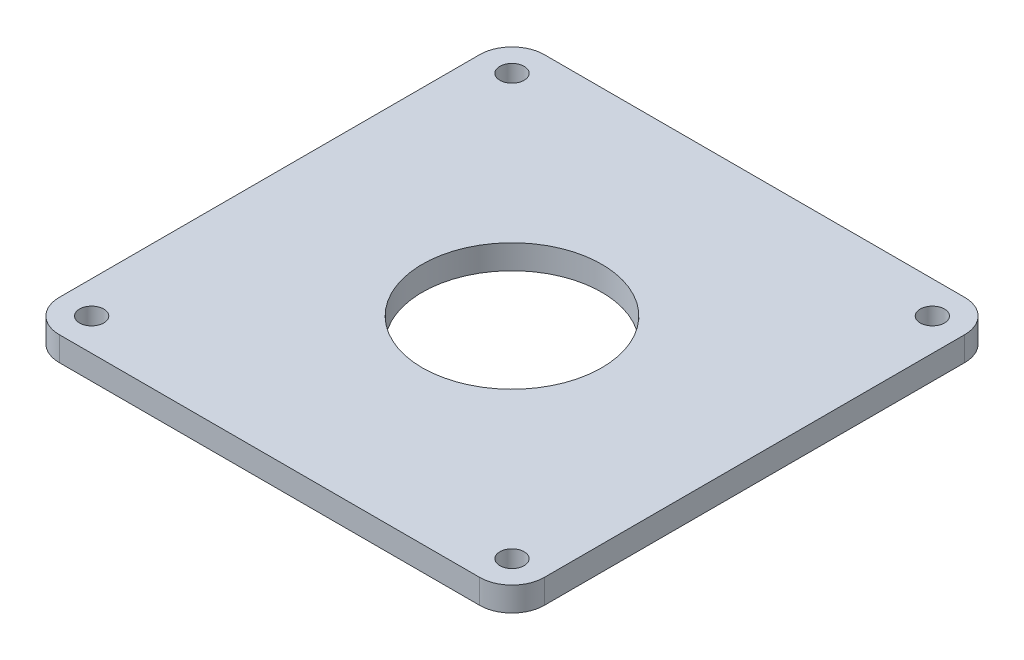
ISO-10303-21;
HEADER;
FILE_DESCRIPTION(('STEP AP214'),'2;1');
FILE_NAME('part.step','',(''),(''),'','','');
FILE_SCHEMA(('AUTOMOTIVE_DESIGN { 1 0 10303 214 1 1 1 1 }'));
ENDSEC;
DATA;
#1=APPLICATION_CONTEXT('core data for automotive mechanical design processes');
#2=APPLICATION_PROTOCOL_DEFINITION('international standard','automotive_design',2000,#1);
#3=PRODUCT_CONTEXT('',#1,'mechanical');
#4=PRODUCT('Part','Part','',(#3));
#5=PRODUCT_RELATED_PRODUCT_CATEGORY('part','',(#4));
#6=PRODUCT_DEFINITION_FORMATION('','',#4);
#7=PRODUCT_DEFINITION_CONTEXT('part definition',#1,'design');
#8=PRODUCT_DEFINITION('design','',#6,#7);
#9=PRODUCT_DEFINITION_SHAPE('','',#8);
#10=(LENGTH_UNIT() NAMED_UNIT(*) SI_UNIT(.MILLI.,.METRE.));
#11=(NAMED_UNIT(*) PLANE_ANGLE_UNIT() SI_UNIT($,.RADIAN.));
#12=(NAMED_UNIT(*) SI_UNIT($,.STERADIAN.) SOLID_ANGLE_UNIT());
#13=UNCERTAINTY_MEASURE_WITH_UNIT(LENGTH_MEASURE(1.E-05),#10,'distance_accuracy_value','');
#14=(GEOMETRIC_REPRESENTATION_CONTEXT(3) GLOBAL_UNCERTAINTY_ASSIGNED_CONTEXT((#13)) GLOBAL_UNIT_ASSIGNED_CONTEXT((#10,
#11,#12)) REPRESENTATION_CONTEXT('',''));
#15=CARTESIAN_POINT('',(0.,0.,0.));
#16=DIRECTION('',(0.,0.,1.));
#17=DIRECTION('',(1.,0.,0.));
#18=AXIS2_PLACEMENT_3D('',#15,#16,#17);
#19=CARTESIAN_POINT('',(-26.,3.,26.));
#20=DIRECTION('',(0.,-1.,0.));
#21=DIRECTION('',(0.,0.,-1.));
#22=AXIS2_PLACEMENT_3D('',#19,#20,#21);
#23=PLANE('',#22);
#24=CARTESIAN_POINT('',(-26.,3.,26.));
#25=DIRECTION('',(0.,1.,0.));
#26=DIRECTION('',(0.,0.,-1.));
#27=AXIS2_PLACEMENT_3D('',#24,#25,#26);
#28=CIRCLE('',#27,4.);
#29=CARTESIAN_POINT('',(-30.,3.,26.));
#30=VERTEX_POINT('',#29);
#31=CARTESIAN_POINT('',(-26.,3.,30.));
#32=VERTEX_POINT('',#31);
#33=EDGE_CURVE('E170',#30,#32,#28,.T.);
#34=ORIENTED_EDGE('',*,*,#33,.T.);
#35=DIRECTION('',(1.,0.,0.));
#36=VECTOR('',#35,1.);
#37=CARTESIAN_POINT('',(-26.,3.,30.));
#38=LINE('',#37,#36);
#39=CARTESIAN_POINT('',(26.,3.,30.));
#40=VERTEX_POINT('',#39);
#41=EDGE_CURVE('E106',#32,#40,#38,.T.);
#42=ORIENTED_EDGE('',*,*,#41,.T.);
#43=CARTESIAN_POINT('',(26.,3.,26.));
#44=DIRECTION('',(0.,1.,0.));
#45=DIRECTION('',(0.,0.,1.));
#46=AXIS2_PLACEMENT_3D('',#43,#44,#45);
#47=CIRCLE('',#46,4.);
#48=CARTESIAN_POINT('',(30.,3.,26.));
#49=VERTEX_POINT('',#48);
#50=EDGE_CURVE('E191',#40,#49,#47,.T.);
#51=ORIENTED_EDGE('',*,*,#50,.T.);
#52=DIRECTION('',(0.,0.,-1.));
#53=VECTOR('',#52,1.);
#54=CARTESIAN_POINT('',(30.,3.,26.));
#55=LINE('',#54,#53);
#56=CARTESIAN_POINT('',(30.,3.,-26.));
#57=VERTEX_POINT('',#56);
#58=EDGE_CURVE('E205',#49,#57,#55,.T.);
#59=ORIENTED_EDGE('',*,*,#58,.T.);
#60=CARTESIAN_POINT('',(26.,3.,-26.));
#61=DIRECTION('',(0.,1.,0.));
#62=DIRECTION('',(0.,0.,-1.));
#63=AXIS2_PLACEMENT_3D('',#60,#61,#62);
#64=CIRCLE('',#63,4.);
#65=CARTESIAN_POINT('',(26.,3.,-30.));
#66=VERTEX_POINT('',#65);
#67=EDGE_CURVE('E125',#57,#66,#64,.T.);
#68=ORIENTED_EDGE('',*,*,#67,.T.);
#69=DIRECTION('',(-1.,0.,0.));
#70=VECTOR('',#69,1.);
#71=CARTESIAN_POINT('',(-26.,3.,-30.));
#72=LINE('',#71,#70);
#73=CARTESIAN_POINT('',(-26.,3.,-30.));
#74=VERTEX_POINT('',#73);
#75=EDGE_CURVE('E119',#66,#74,#72,.T.);
#76=ORIENTED_EDGE('',*,*,#75,.T.);
#77=CARTESIAN_POINT('',(-26.,3.,-26.));
#78=DIRECTION('',(0.,1.,0.));
#79=DIRECTION('',(0.,0.,-1.));
#80=AXIS2_PLACEMENT_3D('',#77,#78,#79);
#81=CIRCLE('',#80,4.);
#82=CARTESIAN_POINT('',(-30.,3.,-26.));
#83=VERTEX_POINT('',#82);
#84=EDGE_CURVE('E123',#74,#83,#81,.T.);
#85=ORIENTED_EDGE('',*,*,#84,.T.);
#86=DIRECTION('',(0.,0.,1.));
#87=VECTOR('',#86,1.);
#88=CARTESIAN_POINT('',(-30.,3.,26.));
#89=LINE('',#88,#87);
#90=EDGE_CURVE('E63',#83,#30,#89,.T.);
#91=ORIENTED_EDGE('',*,*,#90,.T.);
#92=EDGE_LOOP('',(#34,#42,#51,#59,#68,#76,#85,#91));
#93=FACE_BOUND('',#92,.T.);
#94=CARTESIAN_POINT('',(-26.,3.,-26.));
#95=DIRECTION('',(0.,1.,0.));
#96=DIRECTION('',(0.,0.,1.));
#97=AXIS2_PLACEMENT_3D('',#94,#95,#96);
#98=CIRCLE('',#97,1.5);
#99=CARTESIAN_POINT('',(-26.,3.,-24.5));
#100=VERTEX_POINT('',#99);
#101=EDGE_CURVE('E152',#100,#100,#98,.T.);
#102=ORIENTED_EDGE('',*,*,#101,.F.);
#103=EDGE_LOOP('',(#102));
#104=FACE_BOUND('',#103,.T.);
#105=CARTESIAN_POINT('',(26.0000000000001,3.,-25.9999999999999));
#106=DIRECTION('',(0.,1.,0.));
#107=DIRECTION('',(0.,0.,1.));
#108=AXIS2_PLACEMENT_3D('',#105,#106,#107);
#109=CIRCLE('',#108,1.5);
#110=CARTESIAN_POINT('',(26.0000000000001,3.,-24.4999999999999));
#111=VERTEX_POINT('',#110);
#112=EDGE_CURVE('E219',#111,#111,#109,.T.);
#113=ORIENTED_EDGE('',*,*,#112,.F.);
#114=EDGE_LOOP('',(#113));
#115=FACE_BOUND('',#114,.T.);
#116=CARTESIAN_POINT('',(25.9999999999998,3.,26.0000000000002));
#117=DIRECTION('',(0.,1.,0.));
#118=DIRECTION('',(0.,0.,1.));
#119=AXIS2_PLACEMENT_3D('',#116,#117,#118);
#120=CIRCLE('',#119,1.5);
#121=CARTESIAN_POINT('',(25.9999999999998,3.,27.5000000000002));
#122=VERTEX_POINT('',#121);
#123=EDGE_CURVE('E227',#122,#122,#120,.T.);
#124=ORIENTED_EDGE('',*,*,#123,.F.);
#125=EDGE_LOOP('',(#124));
#126=FACE_BOUND('',#125,.T.);
#127=CARTESIAN_POINT('',(-26.0000000000003,3.,25.9999999999997));
#128=DIRECTION('',(0.,1.,0.));
#129=DIRECTION('',(0.,0.,1.));
#130=AXIS2_PLACEMENT_3D('',#127,#128,#129);
#131=CIRCLE('',#130,1.5);
#132=CARTESIAN_POINT('',(-26.0000000000003,3.,27.4999999999997));
#133=VERTEX_POINT('',#132);
#134=EDGE_CURVE('E235',#133,#133,#131,.T.);
#135=ORIENTED_EDGE('',*,*,#134,.F.);
#136=EDGE_LOOP('',(#135));
#137=FACE_BOUND('',#136,.T.);
#138=CARTESIAN_POINT('',(0.,3.,0.));
#139=DIRECTION('',(0.,1.,0.));
#140=DIRECTION('',(0.,0.,1.));
#141=AXIS2_PLACEMENT_3D('',#138,#139,#140);
#142=CIRCLE('',#141,11.1);
#143=CARTESIAN_POINT('',(0.,3.,11.1));
#144=VERTEX_POINT('',#143);
#145=EDGE_CURVE('E243',#144,#144,#142,.T.);
#146=ORIENTED_EDGE('',*,*,#145,.F.);
#147=EDGE_LOOP('',(#146));
#148=FACE_BOUND('',#147,.T.);
#149=ADVANCED_FACE('F45',(#93,#104,#115,#126,#137,#148),#23,.F.);
#150=CARTESIAN_POINT('',(-26.,0.,26.));
#151=DIRECTION('',(0.,-1.,0.));
#152=DIRECTION('',(0.,0.,-1.));
#153=AXIS2_PLACEMENT_3D('',#150,#151,#152);
#154=PLANE('',#153);
#155=CARTESIAN_POINT('',(-26.0000000000003,0.,25.9999999999997));
#156=DIRECTION('',(0.,1.,0.));
#157=DIRECTION('',(0.,0.,1.));
#158=AXIS2_PLACEMENT_3D('',#155,#156,#157);
#159=CIRCLE('',#158,1.5);
#160=CARTESIAN_POINT('',(-26.0000000000003,0.,27.4999999999997));
#161=VERTEX_POINT('',#160);
#162=EDGE_CURVE('E239',#161,#161,#159,.T.);
#163=ORIENTED_EDGE('',*,*,#162,.T.);
#164=EDGE_LOOP('',(#163));
#165=FACE_BOUND('',#164,.T.);
#166=CARTESIAN_POINT('',(26.0000000000001,0.,-25.9999999999999));
#167=DIRECTION('',(0.,1.,0.));
#168=DIRECTION('',(0.,0.,1.));
#169=AXIS2_PLACEMENT_3D('',#166,#167,#168);
#170=CIRCLE('',#169,1.5);
#171=CARTESIAN_POINT('',(26.0000000000001,0.,-24.4999999999999));
#172=VERTEX_POINT('',#171);
#173=EDGE_CURVE('E223',#172,#172,#170,.T.);
#174=ORIENTED_EDGE('',*,*,#173,.T.);
#175=EDGE_LOOP('',(#174));
#176=FACE_BOUND('',#175,.T.);
#177=CARTESIAN_POINT('',(-26.,0.,26.));
#178=DIRECTION('',(0.,1.,0.));
#179=DIRECTION('',(0.,0.,-1.));
#180=AXIS2_PLACEMENT_3D('',#177,#178,#179);
#181=CIRCLE('',#180,4.);
#182=CARTESIAN_POINT('',(-30.,0.,26.));
#183=VERTEX_POINT('',#182);
#184=CARTESIAN_POINT('',(-26.,0.,30.));
#185=VERTEX_POINT('',#184);
#186=EDGE_CURVE('E147',#183,#185,#181,.T.);
#187=ORIENTED_EDGE('',*,*,#186,.F.);
#188=DIRECTION('',(0.,0.,1.));
#189=VECTOR('',#188,1.);
#190=CARTESIAN_POINT('',(-30.,0.,26.));
#191=LINE('',#190,#189);
#192=CARTESIAN_POINT('',(-30.,0.,-26.));
#193=VERTEX_POINT('',#192);
#194=EDGE_CURVE('E98',#193,#183,#191,.T.);
#195=ORIENTED_EDGE('',*,*,#194,.F.);
#196=CARTESIAN_POINT('',(-26.,0.,-26.));
#197=DIRECTION('',(0.,1.,0.));
#198=DIRECTION('',(0.,0.,-1.));
#199=AXIS2_PLACEMENT_3D('',#196,#197,#198);
#200=CIRCLE('',#199,4.);
#201=CARTESIAN_POINT('',(-26.,0.,-30.));
#202=VERTEX_POINT('',#201);
#203=EDGE_CURVE('E92',#202,#193,#200,.T.);
#204=ORIENTED_EDGE('',*,*,#203,.F.);
#205=DIRECTION('',(-1.,0.,0.));
#206=VECTOR('',#205,1.);
#207=CARTESIAN_POINT('',(-26.,0.,-30.));
#208=LINE('',#207,#206);
#209=CARTESIAN_POINT('',(26.,0.,-30.));
#210=VERTEX_POINT('',#209);
#211=EDGE_CURVE('E134',#210,#202,#208,.T.);
#212=ORIENTED_EDGE('',*,*,#211,.F.);
#213=CARTESIAN_POINT('',(26.,0.,-26.));
#214=DIRECTION('',(0.,1.,0.));
#215=DIRECTION('',(0.,0.,-1.));
#216=AXIS2_PLACEMENT_3D('',#213,#214,#215);
#217=CIRCLE('',#216,4.);
#218=CARTESIAN_POINT('',(30.,0.,-26.));
#219=VERTEX_POINT('',#218);
#220=EDGE_CURVE('E161',#219,#210,#217,.T.);
#221=ORIENTED_EDGE('',*,*,#220,.F.);
#222=DIRECTION('',(0.,0.,-1.));
#223=VECTOR('',#222,1.);
#224=CARTESIAN_POINT('',(30.,0.,26.));
#225=LINE('',#224,#223);
#226=CARTESIAN_POINT('',(30.,0.,26.));
#227=VERTEX_POINT('',#226);
#228=EDGE_CURVE('E158',#227,#219,#225,.T.);
#229=ORIENTED_EDGE('',*,*,#228,.F.);
#230=CARTESIAN_POINT('',(26.,0.,26.));
#231=DIRECTION('',(0.,1.,0.));
#232=DIRECTION('',(0.,0.,1.));
#233=AXIS2_PLACEMENT_3D('',#230,#231,#232);
#234=CIRCLE('',#233,4.);
#235=CARTESIAN_POINT('',(26.,0.,30.));
#236=VERTEX_POINT('',#235);
#237=EDGE_CURVE('E155',#236,#227,#234,.T.);
#238=ORIENTED_EDGE('',*,*,#237,.F.);
#239=DIRECTION('',(1.,0.,0.));
#240=VECTOR('',#239,1.);
#241=CARTESIAN_POINT('',(-26.,0.,30.));
#242=LINE('',#241,#240);
#243=EDGE_CURVE('E151',#185,#236,#242,.T.);
#244=ORIENTED_EDGE('',*,*,#243,.F.);
#245=EDGE_LOOP('',(#187,#195,#204,#212,#221,#229,#238,#244));
#246=FACE_BOUND('',#245,.T.);
#247=CARTESIAN_POINT('',(-26.,0.,-26.));
#248=DIRECTION('',(0.,1.,0.));
#249=DIRECTION('',(0.,0.,1.));
#250=AXIS2_PLACEMENT_3D('',#247,#248,#249);
#251=CIRCLE('',#250,1.5);
#252=CARTESIAN_POINT('',(-26.,0.,-24.5));
#253=VERTEX_POINT('',#252);
#254=EDGE_CURVE('E215',#253,#253,#251,.T.);
#255=ORIENTED_EDGE('',*,*,#254,.T.);
#256=EDGE_LOOP('',(#255));
#257=FACE_BOUND('',#256,.T.);
#258=CARTESIAN_POINT('',(25.9999999999998,0.,26.0000000000002));
#259=DIRECTION('',(0.,1.,0.));
#260=DIRECTION('',(0.,0.,1.));
#261=AXIS2_PLACEMENT_3D('',#258,#259,#260);
#262=CIRCLE('',#261,1.5);
#263=CARTESIAN_POINT('',(25.9999999999998,0.,27.5000000000002));
#264=VERTEX_POINT('',#263);
#265=EDGE_CURVE('E231',#264,#264,#262,.T.);
#266=ORIENTED_EDGE('',*,*,#265,.T.);
#267=EDGE_LOOP('',(#266));
#268=FACE_BOUND('',#267,.T.);
#269=CARTESIAN_POINT('',(0.,0.,0.));
#270=DIRECTION('',(0.,1.,0.));
#271=DIRECTION('',(0.,0.,1.));
#272=AXIS2_PLACEMENT_3D('',#269,#270,#271);
#273=CIRCLE('',#272,11.1);
#274=CARTESIAN_POINT('',(0.,0.,11.1));
#275=VERTEX_POINT('',#274);
#276=EDGE_CURVE('E247',#275,#275,#273,.T.);
#277=ORIENTED_EDGE('',*,*,#276,.T.);
#278=EDGE_LOOP('',(#277));
#279=FACE_BOUND('',#278,.T.);
#280=ADVANCED_FACE('F195',(#165,#176,#246,#257,#268,#279),#154,.T.);
#281=CARTESIAN_POINT('',(-26.,3.,26.));
#282=DIRECTION('',(0.,-1.,0.));
#283=DIRECTION('',(0.,0.,-1.));
#284=AXIS2_PLACEMENT_3D('',#281,#282,#283);
#285=CYLINDRICAL_SURFACE('',#284,4.);
#286=ORIENTED_EDGE('',*,*,#186,.T.);
#287=DIRECTION('',(0.,-1.,0.));
#288=VECTOR('',#287,1.);
#289=CARTESIAN_POINT('',(-26.,3.,30.));
#290=LINE('',#289,#288);
#291=EDGE_CURVE('E11',#32,#185,#290,.T.);
#292=ORIENTED_EDGE('',*,*,#291,.F.);
#293=ORIENTED_EDGE('',*,*,#33,.F.);
#294=DIRECTION('',(0.,-1.,0.));
#295=VECTOR('',#294,1.);
#296=CARTESIAN_POINT('',(-30.,3.,26.));
#297=LINE('',#296,#295);
#298=EDGE_CURVE('E143',#30,#183,#297,.T.);
#299=ORIENTED_EDGE('',*,*,#298,.T.);
#300=EDGE_LOOP('',(#286,#292,#293,#299));
#301=FACE_BOUND('',#300,.T.);
#302=ADVANCED_FACE('F47',(#301),#285,.T.);
#303=CARTESIAN_POINT('',(-26.,3.,30.));
#304=DIRECTION('',(0.,0.,-1.));
#305=DIRECTION('',(-1.,0.,0.));
#306=AXIS2_PLACEMENT_3D('',#303,#304,#305);
#307=PLANE('',#306);
#308=ORIENTED_EDGE('',*,*,#243,.T.);
#309=DIRECTION('',(0.,-1.,0.));
#310=VECTOR('',#309,1.);
#311=CARTESIAN_POINT('',(26.,3.,30.));
#312=LINE('',#311,#310);
#313=EDGE_CURVE('E55',#40,#236,#312,.T.);
#314=ORIENTED_EDGE('',*,*,#313,.F.);
#315=ORIENTED_EDGE('',*,*,#41,.F.);
#316=ORIENTED_EDGE('',*,*,#291,.T.);
#317=EDGE_LOOP('',(#308,#314,#315,#316));
#318=FACE_BOUND('',#317,.T.);
#319=ADVANCED_FACE('F281',(#318),#307,.F.);
#320=CARTESIAN_POINT('',(26.,3.,26.));
#321=DIRECTION('',(0.,-1.,0.));
#322=DIRECTION('',(0.,0.,-1.));
#323=AXIS2_PLACEMENT_3D('',#320,#321,#322);
#324=CYLINDRICAL_SURFACE('',#323,4.);
#325=ORIENTED_EDGE('',*,*,#237,.T.);
#326=DIRECTION('',(0.,-1.,0.));
#327=VECTOR('',#326,1.);
#328=CARTESIAN_POINT('',(30.,3.,26.));
#329=LINE('',#328,#327);
#330=EDGE_CURVE('E181',#49,#227,#329,.T.);
#331=ORIENTED_EDGE('',*,*,#330,.F.);
#332=ORIENTED_EDGE('',*,*,#50,.F.);
#333=ORIENTED_EDGE('',*,*,#313,.T.);
#334=EDGE_LOOP('',(#325,#331,#332,#333));
#335=FACE_BOUND('',#334,.T.);
#336=ADVANCED_FACE('F189',(#335),#324,.T.);
#337=CARTESIAN_POINT('',(30.,3.,26.));
#338=DIRECTION('',(-1.,0.,0.));
#339=DIRECTION('',(0.,0.,1.));
#340=AXIS2_PLACEMENT_3D('',#337,#338,#339);
#341=PLANE('',#340);
#342=ORIENTED_EDGE('',*,*,#228,.T.);
#343=DIRECTION('',(0.,-1.,0.));
#344=VECTOR('',#343,1.);
#345=CARTESIAN_POINT('',(30.,3.,-26.));
#346=LINE('',#345,#344);
#347=EDGE_CURVE('E177',#57,#219,#346,.T.);
#348=ORIENTED_EDGE('',*,*,#347,.F.);
#349=ORIENTED_EDGE('',*,*,#58,.F.);
#350=ORIENTED_EDGE('',*,*,#330,.T.);
#351=EDGE_LOOP('',(#342,#348,#349,#350));
#352=FACE_BOUND('',#351,.T.);
#353=ADVANCED_FACE('F200',(#352),#341,.F.);
#354=CARTESIAN_POINT('',(26.,3.,-26.));
#355=DIRECTION('',(0.,-1.,0.));
#356=DIRECTION('',(0.,0.,-1.));
#357=AXIS2_PLACEMENT_3D('',#354,#355,#356);
#358=CYLINDRICAL_SURFACE('',#357,4.);
#359=ORIENTED_EDGE('',*,*,#220,.T.);
#360=DIRECTION('',(0.,-1.,0.));
#361=VECTOR('',#360,1.);
#362=CARTESIAN_POINT('',(26.,3.,-30.));
#363=LINE('',#362,#361);
#364=EDGE_CURVE('E136',#66,#210,#363,.T.);
#365=ORIENTED_EDGE('',*,*,#364,.F.);
#366=ORIENTED_EDGE('',*,*,#67,.F.);
#367=ORIENTED_EDGE('',*,*,#347,.T.);
#368=EDGE_LOOP('',(#359,#365,#366,#367));
#369=FACE_BOUND('',#368,.T.);
#370=ADVANCED_FACE('F203',(#369),#358,.T.);
#371=CARTESIAN_POINT('',(-26.,3.,-30.));
#372=DIRECTION('',(0.,0.,1.));
#373=DIRECTION('',(1.,0.,0.));
#374=AXIS2_PLACEMENT_3D('',#371,#372,#373);
#375=PLANE('',#374);
#376=ORIENTED_EDGE('',*,*,#211,.T.);
#377=DIRECTION('',(0.,-1.,0.));
#378=VECTOR('',#377,1.);
#379=CARTESIAN_POINT('',(-26.,3.,-30.));
#380=LINE('',#379,#378);
#381=EDGE_CURVE('E131',#74,#202,#380,.T.);
#382=ORIENTED_EDGE('',*,*,#381,.F.);
#383=ORIENTED_EDGE('',*,*,#75,.F.);
#384=ORIENTED_EDGE('',*,*,#364,.T.);
#385=EDGE_LOOP('',(#376,#382,#383,#384));
#386=FACE_BOUND('',#385,.T.);
#387=ADVANCED_FACE('F132',(#386),#375,.F.);
#388=CARTESIAN_POINT('',(-26.,3.,-26.));
#389=DIRECTION('',(0.,-1.,0.));
#390=DIRECTION('',(0.,0.,-1.));
#391=AXIS2_PLACEMENT_3D('',#388,#389,#390);
#392=CYLINDRICAL_SURFACE('',#391,4.);
#393=ORIENTED_EDGE('',*,*,#203,.T.);
#394=DIRECTION('',(0.,-1.,0.));
#395=VECTOR('',#394,1.);
#396=CARTESIAN_POINT('',(-30.,3.,-26.));
#397=LINE('',#396,#395);
#398=EDGE_CURVE('E137',#83,#193,#397,.T.);
#399=ORIENTED_EDGE('',*,*,#398,.F.);
#400=ORIENTED_EDGE('',*,*,#84,.F.);
#401=ORIENTED_EDGE('',*,*,#381,.T.);
#402=EDGE_LOOP('',(#393,#399,#400,#401));
#403=FACE_BOUND('',#402,.T.);
#404=ADVANCED_FACE('F139',(#403),#392,.T.);
#405=CARTESIAN_POINT('',(-30.,3.,26.));
#406=DIRECTION('',(1.,0.,0.));
#407=DIRECTION('',(0.,0.,-1.));
#408=AXIS2_PLACEMENT_3D('',#405,#406,#407);
#409=PLANE('',#408);
#410=ORIENTED_EDGE('',*,*,#194,.T.);
#411=ORIENTED_EDGE('',*,*,#298,.F.);
#412=ORIENTED_EDGE('',*,*,#90,.F.);
#413=ORIENTED_EDGE('',*,*,#398,.T.);
#414=EDGE_LOOP('',(#410,#411,#412,#413));
#415=FACE_BOUND('',#414,.T.);
#416=ADVANCED_FACE('F269',(#415),#409,.F.);
#417=CARTESIAN_POINT('',(-26.,3.,-26.));
#418=DIRECTION('',(0.,-1.,0.));
#419=DIRECTION('',(0.,0.,-1.));
#420=AXIS2_PLACEMENT_3D('',#417,#418,#419);
#421=CYLINDRICAL_SURFACE('',#420,1.5);
#422=ORIENTED_EDGE('',*,*,#101,.T.);
#423=EDGE_LOOP('',(#422));
#424=FACE_BOUND('',#423,.T.);
#425=ORIENTED_EDGE('',*,*,#254,.F.);
#426=EDGE_LOOP('',(#425));
#427=FACE_BOUND('',#426,.T.);
#428=ADVANCED_FACE('F266',(#424,#427),#421,.F.);
#429=CARTESIAN_POINT('',(26.0000000000001,3.,-25.9999999999999));
#430=DIRECTION('',(0.,-1.,0.));
#431=DIRECTION('',(0.,0.,-1.));
#432=AXIS2_PLACEMENT_3D('',#429,#430,#431);
#433=CYLINDRICAL_SURFACE('',#432,1.5);
#434=ORIENTED_EDGE('',*,*,#112,.T.);
#435=EDGE_LOOP('',(#434));
#436=FACE_BOUND('',#435,.T.);
#437=ORIENTED_EDGE('',*,*,#173,.F.);
#438=EDGE_LOOP('',(#437));
#439=FACE_BOUND('',#438,.T.);
#440=ADVANCED_FACE('F344',(#436,#439),#433,.F.);
#441=CARTESIAN_POINT('',(25.9999999999998,3.,26.0000000000002));
#442=DIRECTION('',(0.,-1.,0.));
#443=DIRECTION('',(0.,0.,-1.));
#444=AXIS2_PLACEMENT_3D('',#441,#442,#443);
#445=CYLINDRICAL_SURFACE('',#444,1.5);
#446=ORIENTED_EDGE('',*,*,#123,.T.);
#447=EDGE_LOOP('',(#446));
#448=FACE_BOUND('',#447,.T.);
#449=ORIENTED_EDGE('',*,*,#265,.F.);
#450=EDGE_LOOP('',(#449));
#451=FACE_BOUND('',#450,.T.);
#452=ADVANCED_FACE('F352',(#448,#451),#445,.F.);
#453=CARTESIAN_POINT('',(-26.0000000000003,3.,25.9999999999997));
#454=DIRECTION('',(0.,-1.,0.));
#455=DIRECTION('',(0.,0.,-1.));
#456=AXIS2_PLACEMENT_3D('',#453,#454,#455);
#457=CYLINDRICAL_SURFACE('',#456,1.5);
#458=ORIENTED_EDGE('',*,*,#134,.T.);
#459=EDGE_LOOP('',(#458));
#460=FACE_BOUND('',#459,.T.);
#461=ORIENTED_EDGE('',*,*,#162,.F.);
#462=EDGE_LOOP('',(#461));
#463=FACE_BOUND('',#462,.T.);
#464=ADVANCED_FACE('F360',(#460,#463),#457,.F.);
#465=CARTESIAN_POINT('',(0.,3.,0.));
#466=DIRECTION('',(0.,-1.,0.));
#467=DIRECTION('',(0.,0.,-1.));
#468=AXIS2_PLACEMENT_3D('',#465,#466,#467);
#469=CYLINDRICAL_SURFACE('',#468,11.1);
#470=ORIENTED_EDGE('',*,*,#145,.T.);
#471=EDGE_LOOP('',(#470));
#472=FACE_BOUND('',#471,.T.);
#473=ORIENTED_EDGE('',*,*,#276,.F.);
#474=EDGE_LOOP('',(#473));
#475=FACE_BOUND('',#474,.T.);
#476=ADVANCED_FACE('F255',(#472,#475),#469,.F.);
#477=CLOSED_SHELL('',(#149,#280,#302,#319,#336,#353,#370,#387,#404,#416,#428,#440,#452,#464,#476));
#478=MANIFOLD_SOLID_BREP('B2',#477);
#479=ADVANCED_BREP_SHAPE_REPRESENTATION('',(#18,#478),#14);
#480=SHAPE_DEFINITION_REPRESENTATION(#9,#479);
ENDSEC;
END-ISO-10303-21;
